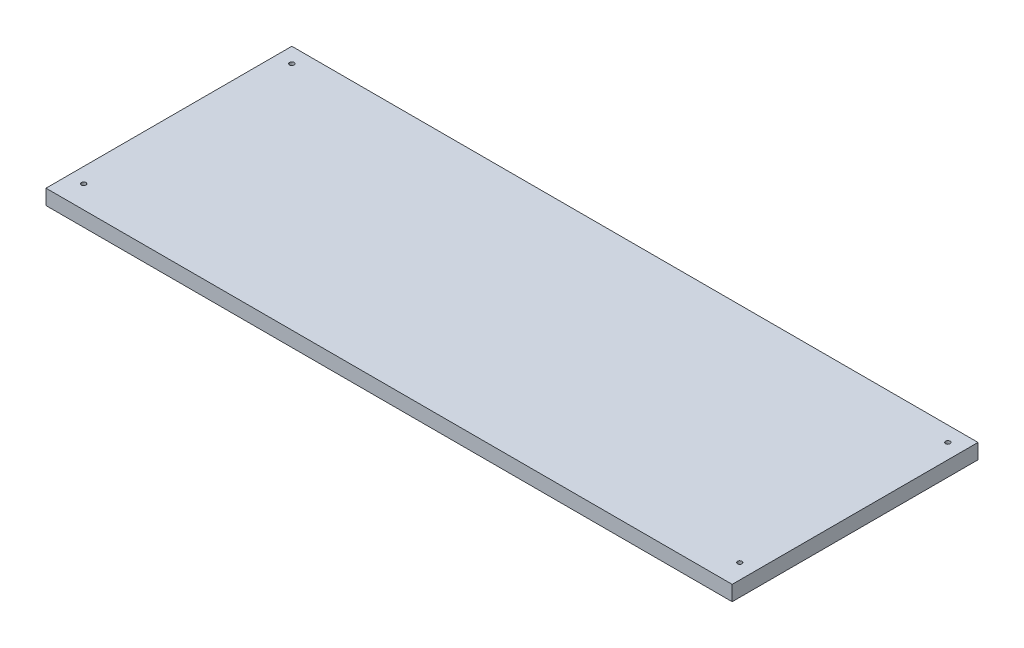
ISO-10303-21;
HEADER;
FILE_DESCRIPTION(('STEP AP214'),'2;1');
FILE_NAME('part.step','',(''),(''),'','','');
FILE_SCHEMA(('AUTOMOTIVE_DESIGN { 1 0 10303 214 1 1 1 1 }'));
ENDSEC;
DATA;
#1=APPLICATION_CONTEXT('core data for automotive mechanical design processes');
#2=APPLICATION_PROTOCOL_DEFINITION('international standard','automotive_design',2000,#1);
#3=PRODUCT_CONTEXT('',#1,'mechanical');
#4=PRODUCT('Part','Part','',(#3));
#5=PRODUCT_RELATED_PRODUCT_CATEGORY('part','',(#4));
#6=PRODUCT_DEFINITION_FORMATION('','',#4);
#7=PRODUCT_DEFINITION_CONTEXT('part definition',#1,'design');
#8=PRODUCT_DEFINITION('design','',#6,#7);
#9=PRODUCT_DEFINITION_SHAPE('','',#8);
#10=(LENGTH_UNIT() NAMED_UNIT(*) SI_UNIT(.MILLI.,.METRE.));
#11=(NAMED_UNIT(*) PLANE_ANGLE_UNIT() SI_UNIT($,.RADIAN.));
#12=(NAMED_UNIT(*) SI_UNIT($,.STERADIAN.) SOLID_ANGLE_UNIT());
#13=UNCERTAINTY_MEASURE_WITH_UNIT(LENGTH_MEASURE(1.E-05),#10,'distance_accuracy_value','');
#14=(GEOMETRIC_REPRESENTATION_CONTEXT(3) GLOBAL_UNCERTAINTY_ASSIGNED_CONTEXT((#13)) GLOBAL_UNIT_ASSIGNED_CONTEXT((#10,
#11,#12)) REPRESENTATION_CONTEXT('',''));
#15=CARTESIAN_POINT('',(0.,0.,0.));
#16=DIRECTION('',(0.,0.,1.));
#17=DIRECTION('',(1.,0.,0.));
#18=AXIS2_PLACEMENT_3D('',#15,#16,#17);
#19=CARTESIAN_POINT('',(227.5,10.,81.5));
#20=DIRECTION('',(-1.,0.,0.));
#21=DIRECTION('',(0.,0.,1.));
#22=AXIS2_PLACEMENT_3D('',#19,#20,#21);
#23=PLANE('',#22);
#24=DIRECTION('',(0.,0.,-1.));
#25=VECTOR('',#24,1.);
#26=CARTESIAN_POINT('',(227.5,0.,81.5));
#27=LINE('',#26,#25);
#28=CARTESIAN_POINT('',(227.5,0.,81.5));
#29=VERTEX_POINT('',#28);
#30=CARTESIAN_POINT('',(227.5,0.,-81.5));
#31=VERTEX_POINT('',#30);
#32=EDGE_CURVE('E96',#29,#31,#27,.T.);
#33=ORIENTED_EDGE('',*,*,#32,.T.);
#34=DIRECTION('',(0.,-1.,0.));
#35=VECTOR('',#34,1.);
#36=CARTESIAN_POINT('',(227.5,10.,-81.5));
#37=LINE('',#36,#35);
#38=CARTESIAN_POINT('',(227.5,10.,-81.5));
#39=VERTEX_POINT('',#38);
#40=EDGE_CURVE('E11',#39,#31,#37,.T.);
#41=ORIENTED_EDGE('',*,*,#40,.F.);
#42=DIRECTION('',(0.,0.,-1.));
#43=VECTOR('',#42,1.);
#44=CARTESIAN_POINT('',(227.5,10.,81.5));
#45=LINE('',#44,#43);
#46=CARTESIAN_POINT('',(227.5,10.,81.5));
#47=VERTEX_POINT('',#46);
#48=EDGE_CURVE('E84',#47,#39,#45,.T.);
#49=ORIENTED_EDGE('',*,*,#48,.F.);
#50=DIRECTION('',(0.,-1.,0.));
#51=VECTOR('',#50,1.);
#52=CARTESIAN_POINT('',(227.5,10.,81.5));
#53=LINE('',#52,#51);
#54=EDGE_CURVE('E92',#47,#29,#53,.T.);
#55=ORIENTED_EDGE('',*,*,#54,.T.);
#56=EDGE_LOOP('',(#33,#41,#49,#55));
#57=FACE_BOUND('',#56,.T.);
#58=ADVANCED_FACE('F33',(#57),#23,.F.);
#59=CARTESIAN_POINT('',(-227.5,10.,-81.5));
#60=DIRECTION('',(0.,0.,1.));
#61=DIRECTION('',(1.,0.,0.));
#62=AXIS2_PLACEMENT_3D('',#59,#60,#61);
#63=PLANE('',#62);
#64=DIRECTION('',(-1.,0.,0.));
#65=VECTOR('',#64,1.);
#66=CARTESIAN_POINT('',(-227.5,0.,-81.5));
#67=LINE('',#66,#65);
#68=CARTESIAN_POINT('',(-227.5,0.,-81.5));
#69=VERTEX_POINT('',#68);
#70=EDGE_CURVE('E88',#31,#69,#67,.T.);
#71=ORIENTED_EDGE('',*,*,#70,.T.);
#72=DIRECTION('',(0.,-1.,0.));
#73=VECTOR('',#72,1.);
#74=CARTESIAN_POINT('',(-227.5,10.,-81.5));
#75=LINE('',#74,#73);
#76=CARTESIAN_POINT('',(-227.5,10.,-81.5));
#77=VERTEX_POINT('',#76);
#78=EDGE_CURVE('E41',#77,#69,#75,.T.);
#79=ORIENTED_EDGE('',*,*,#78,.F.);
#80=DIRECTION('',(-1.,0.,0.));
#81=VECTOR('',#80,1.);
#82=CARTESIAN_POINT('',(-227.5,10.,-81.5));
#83=LINE('',#82,#81);
#84=EDGE_CURVE('E79',#39,#77,#83,.T.);
#85=ORIENTED_EDGE('',*,*,#84,.F.);
#86=ORIENTED_EDGE('',*,*,#40,.T.);
#87=EDGE_LOOP('',(#71,#79,#85,#86));
#88=FACE_BOUND('',#87,.T.);
#89=ADVANCED_FACE('F87',(#88),#63,.F.);
#90=CARTESIAN_POINT('',(-227.5,10.,81.5));
#91=DIRECTION('',(1.,0.,0.));
#92=DIRECTION('',(0.,0.,-1.));
#93=AXIS2_PLACEMENT_3D('',#90,#91,#92);
#94=PLANE('',#93);
#95=DIRECTION('',(0.,0.,1.));
#96=VECTOR('',#95,1.);
#97=CARTESIAN_POINT('',(-227.5,0.,81.5));
#98=LINE('',#97,#96);
#99=CARTESIAN_POINT('',(-227.5,0.,81.5));
#100=VERTEX_POINT('',#99);
#101=EDGE_CURVE('E66',#69,#100,#98,.T.);
#102=ORIENTED_EDGE('',*,*,#101,.T.);
#103=DIRECTION('',(0.,-1.,0.));
#104=VECTOR('',#103,1.);
#105=CARTESIAN_POINT('',(-227.5,10.,81.5));
#106=LINE('',#105,#104);
#107=CARTESIAN_POINT('',(-227.5,10.,81.5));
#108=VERTEX_POINT('',#107);
#109=EDGE_CURVE('E89',#108,#100,#106,.T.);
#110=ORIENTED_EDGE('',*,*,#109,.F.);
#111=DIRECTION('',(0.,0.,1.));
#112=VECTOR('',#111,1.);
#113=CARTESIAN_POINT('',(-227.5,10.,81.5));
#114=LINE('',#113,#112);
#115=EDGE_CURVE('E82',#77,#108,#114,.T.);
#116=ORIENTED_EDGE('',*,*,#115,.F.);
#117=ORIENTED_EDGE('',*,*,#78,.T.);
#118=EDGE_LOOP('',(#102,#110,#116,#117));
#119=FACE_BOUND('',#118,.T.);
#120=ADVANCED_FACE('F90',(#119),#94,.F.);
#121=CARTESIAN_POINT('',(-227.5,10.,81.5));
#122=DIRECTION('',(0.,0.,-1.));
#123=DIRECTION('',(-1.,0.,0.));
#124=AXIS2_PLACEMENT_3D('',#121,#122,#123);
#125=PLANE('',#124);
#126=DIRECTION('',(1.,0.,0.));
#127=VECTOR('',#126,1.);
#128=CARTESIAN_POINT('',(-227.5,0.,81.5));
#129=LINE('',#128,#127);
#130=EDGE_CURVE('E72',#100,#29,#129,.T.);
#131=ORIENTED_EDGE('',*,*,#130,.T.);
#132=ORIENTED_EDGE('',*,*,#54,.F.);
#133=DIRECTION('',(1.,0.,0.));
#134=VECTOR('',#133,1.);
#135=CARTESIAN_POINT('',(-227.5,10.,81.5));
#136=LINE('',#135,#134);
#137=EDGE_CURVE('E49',#108,#47,#136,.T.);
#138=ORIENTED_EDGE('',*,*,#137,.F.);
#139=ORIENTED_EDGE('',*,*,#109,.T.);
#140=EDGE_LOOP('',(#131,#132,#138,#139));
#141=FACE_BOUND('',#140,.T.);
#142=ADVANCED_FACE('F104',(#141),#125,.F.);
#143=CARTESIAN_POINT('',(0.,10.,0.));
#144=DIRECTION('',(0.,-1.,0.));
#145=DIRECTION('',(0.,0.,-1.));
#146=AXIS2_PLACEMENT_3D('',#143,#144,#145);
#147=PLANE('',#146);
#148=CARTESIAN_POINT('',(217.5,10.,66.5));
#149=DIRECTION('',(0.,1.,0.));
#150=DIRECTION('',(0.,0.,1.));
#151=AXIS2_PLACEMENT_3D('',#148,#149,#150);
#152=CIRCLE('',#151,1.50000004799999);
#153=CARTESIAN_POINT('',(217.5,10.,68.000000048));
#154=VERTEX_POINT('',#153);
#155=EDGE_CURVE('E130',#154,#154,#152,.T.);
#156=ORIENTED_EDGE('',*,*,#155,.F.);
#157=EDGE_LOOP('',(#156));
#158=FACE_BOUND('',#157,.T.);
#159=CARTESIAN_POINT('',(217.5,10.,-71.5));
#160=DIRECTION('',(0.,1.,0.));
#161=DIRECTION('',(0.,0.,1.));
#162=AXIS2_PLACEMENT_3D('',#159,#160,#161);
#163=CIRCLE('',#162,1.50000004799999);
#164=CARTESIAN_POINT('',(217.5,10.,-69.999999952));
#165=VERTEX_POINT('',#164);
#166=EDGE_CURVE('E124',#165,#165,#163,.T.);
#167=ORIENTED_EDGE('',*,*,#166,.F.);
#168=EDGE_LOOP('',(#167));
#169=FACE_BOUND('',#168,.T.);
#170=CARTESIAN_POINT('',(-217.5,10.,-71.5));
#171=DIRECTION('',(0.,1.,0.));
#172=DIRECTION('',(0.,0.,1.));
#173=AXIS2_PLACEMENT_3D('',#170,#171,#172);
#174=CIRCLE('',#173,1.50000004799999);
#175=CARTESIAN_POINT('',(-217.5,10.,-69.999999952));
#176=VERTEX_POINT('',#175);
#177=EDGE_CURVE('E118',#176,#176,#174,.T.);
#178=ORIENTED_EDGE('',*,*,#177,.F.);
#179=EDGE_LOOP('',(#178));
#180=FACE_BOUND('',#179,.T.);
#181=CARTESIAN_POINT('',(-217.5,10.,66.5));
#182=DIRECTION('',(0.,1.,0.));
#183=DIRECTION('',(0.,0.,1.));
#184=AXIS2_PLACEMENT_3D('',#181,#182,#183);
#185=CIRCLE('',#184,1.50000004799999);
#186=CARTESIAN_POINT('',(-217.5,10.,68.000000048));
#187=VERTEX_POINT('',#186);
#188=EDGE_CURVE('E112',#187,#187,#185,.T.);
#189=ORIENTED_EDGE('',*,*,#188,.F.);
#190=EDGE_LOOP('',(#189));
#191=FACE_BOUND('',#190,.T.);
#192=ORIENTED_EDGE('',*,*,#48,.T.);
#193=ORIENTED_EDGE('',*,*,#84,.T.);
#194=ORIENTED_EDGE('',*,*,#115,.T.);
#195=ORIENTED_EDGE('',*,*,#137,.T.);
#196=EDGE_LOOP('',(#192,#193,#194,#195));
#197=FACE_BOUND('',#196,.T.);
#198=ADVANCED_FACE('F80',(#158,#169,#180,#191,#197),#147,.F.);
#199=CARTESIAN_POINT('',(0.,0.,0.));
#200=DIRECTION('',(0.,-1.,0.));
#201=DIRECTION('',(0.,0.,-1.));
#202=AXIS2_PLACEMENT_3D('',#199,#200,#201);
#203=PLANE('',#202);
#204=CARTESIAN_POINT('',(217.5,0.,66.5));
#205=DIRECTION('',(0.,1.,0.));
#206=DIRECTION('',(0.,0.,1.));
#207=AXIS2_PLACEMENT_3D('',#204,#205,#206);
#208=CIRCLE('',#207,1.50000004799999);
#209=CARTESIAN_POINT('',(217.5,0.,68.000000048));
#210=VERTEX_POINT('',#209);
#211=EDGE_CURVE('E127',#210,#210,#208,.T.);
#212=ORIENTED_EDGE('',*,*,#211,.T.);
#213=EDGE_LOOP('',(#212));
#214=FACE_BOUND('',#213,.T.);
#215=CARTESIAN_POINT('',(217.5,0.,-71.5));
#216=DIRECTION('',(0.,1.,0.));
#217=DIRECTION('',(0.,0.,1.));
#218=AXIS2_PLACEMENT_3D('',#215,#216,#217);
#219=CIRCLE('',#218,1.50000004799999);
#220=CARTESIAN_POINT('',(217.5,0.,-69.999999952));
#221=VERTEX_POINT('',#220);
#222=EDGE_CURVE('E121',#221,#221,#219,.T.);
#223=ORIENTED_EDGE('',*,*,#222,.T.);
#224=EDGE_LOOP('',(#223));
#225=FACE_BOUND('',#224,.T.);
#226=CARTESIAN_POINT('',(-217.5,0.,-71.5));
#227=DIRECTION('',(0.,1.,0.));
#228=DIRECTION('',(0.,0.,1.));
#229=AXIS2_PLACEMENT_3D('',#226,#227,#228);
#230=CIRCLE('',#229,1.50000004799999);
#231=CARTESIAN_POINT('',(-217.5,0.,-69.999999952));
#232=VERTEX_POINT('',#231);
#233=EDGE_CURVE('E115',#232,#232,#230,.T.);
#234=ORIENTED_EDGE('',*,*,#233,.T.);
#235=EDGE_LOOP('',(#234));
#236=FACE_BOUND('',#235,.T.);
#237=CARTESIAN_POINT('',(-217.5,0.,66.5));
#238=DIRECTION('',(0.,1.,0.));
#239=DIRECTION('',(0.,0.,1.));
#240=AXIS2_PLACEMENT_3D('',#237,#238,#239);
#241=CIRCLE('',#240,1.50000004799999);
#242=CARTESIAN_POINT('',(-217.5,0.,68.000000048));
#243=VERTEX_POINT('',#242);
#244=EDGE_CURVE('E99',#243,#243,#241,.T.);
#245=ORIENTED_EDGE('',*,*,#244,.T.);
#246=EDGE_LOOP('',(#245));
#247=FACE_BOUND('',#246,.T.);
#248=ORIENTED_EDGE('',*,*,#32,.F.);
#249=ORIENTED_EDGE('',*,*,#130,.F.);
#250=ORIENTED_EDGE('',*,*,#101,.F.);
#251=ORIENTED_EDGE('',*,*,#70,.F.);
#252=EDGE_LOOP('',(#248,#249,#250,#251));
#253=FACE_BOUND('',#252,.T.);
#254=ADVANCED_FACE('F107',(#214,#225,#236,#247,#253),#203,.T.);
#255=CARTESIAN_POINT('',(-217.5,10.,66.5));
#256=DIRECTION('',(0.,1.,0.));
#257=DIRECTION('',(0.,0.,1.));
#258=AXIS2_PLACEMENT_3D('',#255,#256,#257);
#259=CYLINDRICAL_SURFACE('',#258,1.50000004799999);
#260=ORIENTED_EDGE('',*,*,#244,.F.);
#261=EDGE_LOOP('',(#260));
#262=FACE_BOUND('',#261,.T.);
#263=ORIENTED_EDGE('',*,*,#188,.T.);
#264=EDGE_LOOP('',(#263));
#265=FACE_BOUND('',#264,.T.);
#266=ADVANCED_FACE('F145',(#262,#265),#259,.F.);
#267=CARTESIAN_POINT('',(-217.5,10.,-71.5));
#268=DIRECTION('',(0.,1.,0.));
#269=DIRECTION('',(0.,0.,1.));
#270=AXIS2_PLACEMENT_3D('',#267,#268,#269);
#271=CYLINDRICAL_SURFACE('',#270,1.50000004799999);
#272=ORIENTED_EDGE('',*,*,#233,.F.);
#273=EDGE_LOOP('',(#272));
#274=FACE_BOUND('',#273,.T.);
#275=ORIENTED_EDGE('',*,*,#177,.T.);
#276=EDGE_LOOP('',(#275));
#277=FACE_BOUND('',#276,.T.);
#278=ADVANCED_FACE('F147',(#274,#277),#271,.F.);
#279=CARTESIAN_POINT('',(217.5,10.,-71.5));
#280=DIRECTION('',(0.,1.,0.));
#281=DIRECTION('',(0.,0.,1.));
#282=AXIS2_PLACEMENT_3D('',#279,#280,#281);
#283=CYLINDRICAL_SURFACE('',#282,1.50000004799999);
#284=ORIENTED_EDGE('',*,*,#222,.F.);
#285=EDGE_LOOP('',(#284));
#286=FACE_BOUND('',#285,.T.);
#287=ORIENTED_EDGE('',*,*,#166,.T.);
#288=EDGE_LOOP('',(#287));
#289=FACE_BOUND('',#288,.T.);
#290=ADVANCED_FACE('F154',(#286,#289),#283,.F.);
#291=CARTESIAN_POINT('',(217.5,10.,66.5));
#292=DIRECTION('',(0.,1.,0.));
#293=DIRECTION('',(0.,0.,1.));
#294=AXIS2_PLACEMENT_3D('',#291,#292,#293);
#295=CYLINDRICAL_SURFACE('',#294,1.50000004799999);
#296=ORIENTED_EDGE('',*,*,#211,.F.);
#297=EDGE_LOOP('',(#296));
#298=FACE_BOUND('',#297,.T.);
#299=ORIENTED_EDGE('',*,*,#155,.T.);
#300=EDGE_LOOP('',(#299));
#301=FACE_BOUND('',#300,.T.);
#302=ADVANCED_FACE('F134',(#298,#301),#295,.F.);
#303=CLOSED_SHELL('',(#58,#89,#120,#142,#198,#254,#266,#278,#290,#302));
#304=MANIFOLD_SOLID_BREP('B2',#303);
#305=ADVANCED_BREP_SHAPE_REPRESENTATION('',(#18,#304),#14);
#306=SHAPE_DEFINITION_REPRESENTATION(#9,#305);
ENDSEC;
END-ISO-10303-21;
